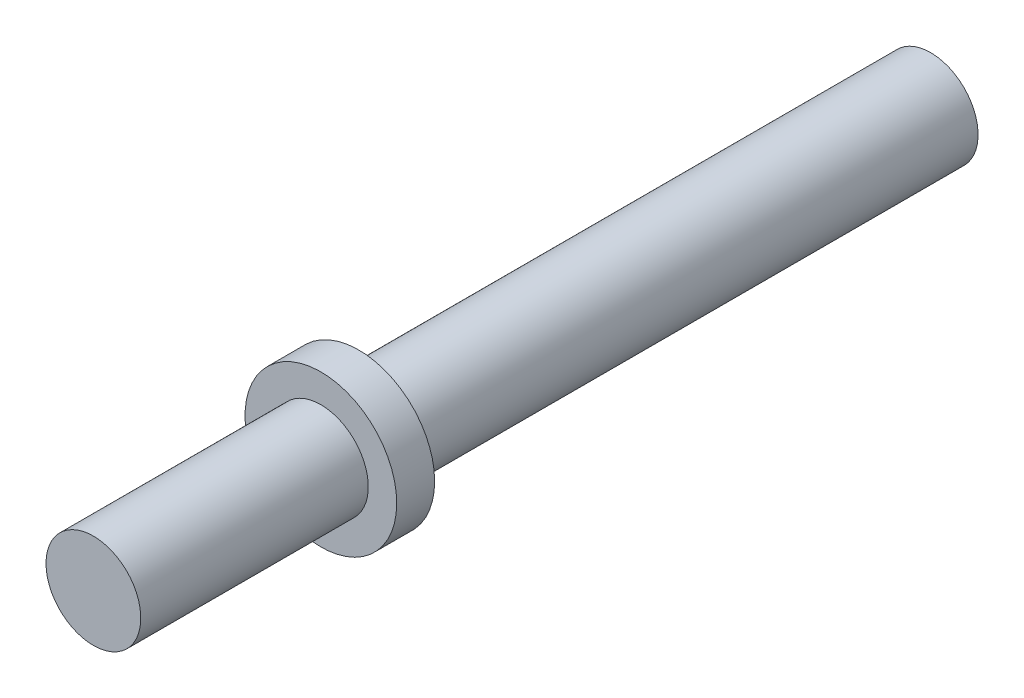
ISO-10303-21;
HEADER;
FILE_DESCRIPTION(('STEP AP214'),'2;1');
FILE_NAME('part.step','',(''),(''),'','','');
FILE_SCHEMA(('AUTOMOTIVE_DESIGN { 1 0 10303 214 1 1 1 1 }'));
ENDSEC;
DATA;
#1=APPLICATION_CONTEXT('core data for automotive mechanical design processes');
#2=APPLICATION_PROTOCOL_DEFINITION('international standard','automotive_design',2000,#1);
#3=PRODUCT_CONTEXT('',#1,'mechanical');
#4=PRODUCT('Part','Part','',(#3));
#5=PRODUCT_RELATED_PRODUCT_CATEGORY('part','',(#4));
#6=PRODUCT_DEFINITION_FORMATION('','',#4);
#7=PRODUCT_DEFINITION_CONTEXT('part definition',#1,'design');
#8=PRODUCT_DEFINITION('design','',#6,#7);
#9=PRODUCT_DEFINITION_SHAPE('','',#8);
#10=(LENGTH_UNIT() NAMED_UNIT(*) SI_UNIT(.MILLI.,.METRE.));
#11=(NAMED_UNIT(*) PLANE_ANGLE_UNIT() SI_UNIT($,.RADIAN.));
#12=(NAMED_UNIT(*) SI_UNIT($,.STERADIAN.) SOLID_ANGLE_UNIT());
#13=UNCERTAINTY_MEASURE_WITH_UNIT(LENGTH_MEASURE(1.E-05),#10,'distance_accuracy_value','');
#14=(GEOMETRIC_REPRESENTATION_CONTEXT(3) GLOBAL_UNCERTAINTY_ASSIGNED_CONTEXT((#13)) GLOBAL_UNIT_ASSIGNED_CONTEXT((#10,
#11,#12)) REPRESENTATION_CONTEXT('',''));
#15=CARTESIAN_POINT('',(0.,0.,0.));
#16=DIRECTION('',(0.,0.,1.));
#17=DIRECTION('',(1.,0.,0.));
#18=AXIS2_PLACEMENT_3D('',#15,#16,#17);
#19=CARTESIAN_POINT('',(-32.018684277368,-41.7454165571395,44.));
#20=DIRECTION('',(0.,0.,-1.));
#21=DIRECTION('',(-1.,0.,0.));
#22=AXIS2_PLACEMENT_3D('',#19,#20,#21);
#23=CYLINDRICAL_SURFACE('',#22,1.5);
#24=CARTESIAN_POINT('',(-32.018684277368,-41.7454165571395,36.8));
#25=DIRECTION('',(0.,0.,1.));
#26=DIRECTION('',(1.,0.,0.));
#27=AXIS2_PLACEMENT_3D('',#24,#25,#26);
#28=CIRCLE('',#27,1.5);
#29=CARTESIAN_POINT('',(-33.518684277368,-41.7454165571395,36.8));
#30=VERTEX_POINT('',#29);
#31=EDGE_CURVE('E44',#30,#30,#28,.T.);
#32=CARTESIAN_POINT('',(-32.018684277368,-41.7454165571395,44.));
#33=DIRECTION('',(0.,0.,1.));
#34=DIRECTION('',(1.,0.,0.));
#35=AXIS2_PLACEMENT_3D('',#32,#33,#34);
#36=CIRCLE('',#35,1.5);
#37=CARTESIAN_POINT('',(-33.518684277368,-41.7454165571395,44.));
#38=VERTEX_POINT('',#37);
#39=EDGE_CURVE('E48',#38,#38,#36,.T.);
#40=CARTESIAN_POINT('',(-33.518684277368,-41.7454165571395,36.8));
#41=CARTESIAN_POINT('',(-33.518684277368,-41.7454165571395,36.875));
#42=CARTESIAN_POINT('',(-33.518684277368,-41.7454165571395,36.95));
#43=CARTESIAN_POINT('',(-33.518684277368,-41.7454165571395,37.1));
#44=CARTESIAN_POINT('',(-33.518684277368,-41.7454165571395,37.175));
#45=CARTESIAN_POINT('',(-33.518684277368,-41.7454165571395,37.325));
#46=CARTESIAN_POINT('',(-33.518684277368,-41.7454165571395,37.4));
#47=CARTESIAN_POINT('',(-33.518684277368,-41.7454165571395,37.55));
#48=CARTESIAN_POINT('',(-33.518684277368,-41.7454165571395,37.625));
#49=CARTESIAN_POINT('',(-33.518684277368,-41.7454165571395,37.775));
#50=CARTESIAN_POINT('',(-33.518684277368,-41.7454165571395,37.85));
#51=CARTESIAN_POINT('',(-33.518684277368,-41.7454165571395,38.));
#52=CARTESIAN_POINT('',(-33.518684277368,-41.7454165571395,38.075));
#53=CARTESIAN_POINT('',(-33.518684277368,-41.7454165571395,38.225));
#54=CARTESIAN_POINT('',(-33.518684277368,-41.7454165571395,38.3));
#55=CARTESIAN_POINT('',(-33.518684277368,-41.7454165571395,38.45));
#56=CARTESIAN_POINT('',(-33.518684277368,-41.7454165571395,38.525));
#57=CARTESIAN_POINT('',(-33.518684277368,-41.7454165571395,38.675));
#58=CARTESIAN_POINT('',(-33.518684277368,-41.7454165571395,38.75));
#59=CARTESIAN_POINT('',(-33.518684277368,-41.7454165571395,38.9));
#60=CARTESIAN_POINT('',(-33.518684277368,-41.7454165571395,38.975));
#61=CARTESIAN_POINT('',(-33.518684277368,-41.7454165571395,39.125));
#62=CARTESIAN_POINT('',(-33.518684277368,-41.7454165571395,39.2));
#63=CARTESIAN_POINT('',(-33.518684277368,-41.7454165571395,39.35));
#64=CARTESIAN_POINT('',(-33.518684277368,-41.7454165571395,39.425));
#65=CARTESIAN_POINT('',(-33.518684277368,-41.7454165571395,39.575));
#66=CARTESIAN_POINT('',(-33.518684277368,-41.7454165571395,39.65));
#67=CARTESIAN_POINT('',(-33.518684277368,-41.7454165571395,39.8));
#68=CARTESIAN_POINT('',(-33.518684277368,-41.7454165571395,39.875));
#69=CARTESIAN_POINT('',(-33.518684277368,-41.7454165571395,40.025));
#70=CARTESIAN_POINT('',(-33.518684277368,-41.7454165571395,40.1));
#71=CARTESIAN_POINT('',(-33.518684277368,-41.7454165571395,40.25));
#72=CARTESIAN_POINT('',(-33.518684277368,-41.7454165571395,40.325));
#73=CARTESIAN_POINT('',(-33.518684277368,-41.7454165571395,40.475));
#74=CARTESIAN_POINT('',(-33.518684277368,-41.7454165571395,40.55));
#75=CARTESIAN_POINT('',(-33.518684277368,-41.7454165571395,40.7));
#76=CARTESIAN_POINT('',(-33.518684277368,-41.7454165571395,40.775));
#77=CARTESIAN_POINT('',(-33.518684277368,-41.7454165571395,40.925));
#78=CARTESIAN_POINT('',(-33.518684277368,-41.7454165571395,41.));
#79=CARTESIAN_POINT('',(-33.518684277368,-41.7454165571395,41.15));
#80=CARTESIAN_POINT('',(-33.518684277368,-41.7454165571395,41.225));
#81=CARTESIAN_POINT('',(-33.518684277368,-41.7454165571395,41.375));
#82=CARTESIAN_POINT('',(-33.518684277368,-41.7454165571395,41.45));
#83=CARTESIAN_POINT('',(-33.518684277368,-41.7454165571395,41.6));
#84=CARTESIAN_POINT('',(-33.518684277368,-41.7454165571395,41.675));
#85=CARTESIAN_POINT('',(-33.518684277368,-41.7454165571395,41.825));
#86=CARTESIAN_POINT('',(-33.518684277368,-41.7454165571395,41.9));
#87=CARTESIAN_POINT('',(-33.518684277368,-41.7454165571395,42.05));
#88=CARTESIAN_POINT('',(-33.518684277368,-41.7454165571395,42.125));
#89=CARTESIAN_POINT('',(-33.518684277368,-41.7454165571395,42.275));
#90=CARTESIAN_POINT('',(-33.518684277368,-41.7454165571395,42.35));
#91=CARTESIAN_POINT('',(-33.518684277368,-41.7454165571395,42.5));
#92=CARTESIAN_POINT('',(-33.518684277368,-41.7454165571395,42.575));
#93=CARTESIAN_POINT('',(-33.518684277368,-41.7454165571395,42.725));
#94=CARTESIAN_POINT('',(-33.518684277368,-41.7454165571395,42.8));
#95=CARTESIAN_POINT('',(-33.518684277368,-41.7454165571395,42.95));
#96=CARTESIAN_POINT('',(-33.518684277368,-41.7454165571395,43.025));
#97=CARTESIAN_POINT('',(-33.518684277368,-41.7454165571395,43.175));
#98=CARTESIAN_POINT('',(-33.518684277368,-41.7454165571395,43.25));
#99=CARTESIAN_POINT('',(-33.518684277368,-41.7454165571395,43.4));
#100=CARTESIAN_POINT('',(-33.518684277368,-41.7454165571395,43.475));
#101=CARTESIAN_POINT('',(-33.518684277368,-41.7454165571395,43.625));
#102=CARTESIAN_POINT('',(-33.518684277368,-41.7454165571395,43.7));
#103=CARTESIAN_POINT('',(-33.518684277368,-41.7454165571395,43.85));
#104=CARTESIAN_POINT('',(-33.518684277368,-41.7454165571395,43.925));
#105=CARTESIAN_POINT('',(-33.518684277368,-41.7454165571395,44.));
#106=B_SPLINE_CURVE_WITH_KNOTS('',3,(#40,#41,#42,#43,#44,#45,#46,#47,#48,#49,#50,#51,#52,#53,
#54,#55,#56,#57,#58,#59,#60,#61,#62,#63,#64,#65,#66,#67,#68,#69,#70,#71,#72,#73,#74,#75,#76,#77,
#78,#79,#80,#81,#82,#83,#84,#85,#86,#87,#88,#89,#90,#91,#92,#93,#94,#95,#96,#97,#98,#99,#100,
#101,#102,#103,#104,#105),.UNSPECIFIED.,.F.,.F.,(4,2,2,2,2,2,2,2,2,2,2,2,2,2,2,2,2,2,2,2,2,2,2,
2,2,2,2,2,2,2,2,2,4),(0.,0.225000000000003,0.449999999999999,0.675000000000002,
0.900000000000005,1.125,1.35,1.575,1.8,2.02500000000001,2.25,2.475,2.7,2.925,3.15,3.375,3.6,
3.825,4.05000000000001,4.275,4.5,4.725,4.95,5.175,5.4,5.62500000000001,5.85,6.075,6.3,6.525,
6.75,6.975,7.2),.UNSPECIFIED.);
#107=EDGE_CURVE('BSEAM41',#30,#38,#106,.T.);
#108=ORIENTED_EDGE('',*,*,#31,.T.);
#109=ORIENTED_EDGE('',*,*,#39,.F.);
#110=ORIENTED_EDGE('',*,*,#107,.T.);
#111=ORIENTED_EDGE('',*,*,#107,.F.);
#112=EDGE_LOOP('',(#108,#110,#109,#111));
#113=FACE_BOUND('',#112,.T.);
#114=ADVANCED_FACE('F41',(#113),#23,.T.);
#115=CARTESIAN_POINT('',(-32.018684277368,-41.7454165571395,44.));
#116=DIRECTION('',(0.,0.,1.));
#117=DIRECTION('',(1.,0.,0.));
#118=AXIS2_PLACEMENT_3D('',#115,#116,#117);
#119=PLANE('',#118);
#120=ORIENTED_EDGE('',*,*,#39,.T.);
#121=EDGE_LOOP('',(#120));
#122=FACE_BOUND('',#121,.T.);
#123=ADVANCED_FACE('F80',(#122),#119,.T.);
#124=CARTESIAN_POINT('',(-32.018684277368,-41.7454165571395,36.8));
#125=DIRECTION('',(0.,0.,-1.));
#126=DIRECTION('',(-1.,0.,0.));
#127=AXIS2_PLACEMENT_3D('',#124,#125,#126);
#128=CYLINDRICAL_SURFACE('',#127,2.4);
#129=CARTESIAN_POINT('',(-32.018684277368,-41.7454165571395,36.8));
#130=DIRECTION('',(0.,0.,1.));
#131=DIRECTION('',(1.,0.,0.));
#132=AXIS2_PLACEMENT_3D('',#129,#130,#131);
#133=CIRCLE('',#132,2.4);
#134=CARTESIAN_POINT('',(-29.618684277368,-41.7454165571395,36.8));
#135=VERTEX_POINT('',#134);
#136=EDGE_CURVE('E60',#135,#135,#133,.T.);
#137=ORIENTED_EDGE('',*,*,#136,.F.);
#138=EDGE_LOOP('',(#137));
#139=FACE_BOUND('',#138,.T.);
#140=CARTESIAN_POINT('',(-32.018684277368,-41.7454165571395,35.6));
#141=DIRECTION('',(0.,0.,1.));
#142=DIRECTION('',(1.,0.,0.));
#143=AXIS2_PLACEMENT_3D('',#140,#141,#142);
#144=CIRCLE('',#143,2.4);
#145=CARTESIAN_POINT('',(-29.618684277368,-41.7454165571395,35.6));
#146=VERTEX_POINT('',#145);
#147=EDGE_CURVE('E57',#146,#146,#144,.T.);
#148=ORIENTED_EDGE('',*,*,#147,.T.);
#149=EDGE_LOOP('',(#148));
#150=FACE_BOUND('',#149,.T.);
#151=ADVANCED_FACE('F72',(#139,#150),#128,.T.);
#152=CARTESIAN_POINT('',(-32.018684277368,-41.7454165571395,36.8));
#153=DIRECTION('',(0.,0.,1.));
#154=DIRECTION('',(1.,0.,0.));
#155=AXIS2_PLACEMENT_3D('',#152,#153,#154);
#156=PLANE('',#155);
#157=ORIENTED_EDGE('',*,*,#31,.F.);
#158=EDGE_LOOP('',(#157));
#159=FACE_BOUND('',#158,.T.);
#160=ORIENTED_EDGE('',*,*,#136,.T.);
#161=EDGE_LOOP('',(#160));
#162=FACE_BOUND('',#161,.T.);
#163=ADVANCED_FACE('F69',(#159,#162),#156,.T.);
#164=CARTESIAN_POINT('',(-32.018684277368,-41.7454165571395,35.6));
#165=DIRECTION('',(0.,0.,1.));
#166=DIRECTION('',(1.,0.,0.));
#167=AXIS2_PLACEMENT_3D('',#164,#165,#166);
#168=PLANE('',#167);
#169=CARTESIAN_POINT('',(-32.018684277368,-41.7454165571395,35.6));
#170=DIRECTION('',(0.,0.,1.));
#171=DIRECTION('',(1.,0.,0.));
#172=AXIS2_PLACEMENT_3D('',#169,#170,#171);
#173=CIRCLE('',#172,1.5);
#174=CARTESIAN_POINT('',(-33.518684277368,-41.7454165571395,35.6));
#175=VERTEX_POINT('',#174);
#176=EDGE_CURVE('E10',#175,#175,#173,.T.);
#177=ORIENTED_EDGE('',*,*,#176,.T.);
#178=EDGE_LOOP('',(#177));
#179=FACE_BOUND('',#178,.T.);
#180=ORIENTED_EDGE('',*,*,#147,.F.);
#181=EDGE_LOOP('',(#180));
#182=FACE_BOUND('',#181,.T.);
#183=ADVANCED_FACE('F71',(#179,#182),#168,.F.);
#184=CARTESIAN_POINT('',(-32.018684277368,-41.7454165571395,17.500063));
#185=DIRECTION('',(0.,0.,1.));
#186=DIRECTION('',(1.,0.,0.));
#187=AXIS2_PLACEMENT_3D('',#184,#185,#186);
#188=PLANE('',#187);
#189=CARTESIAN_POINT('',(-32.018684277368,-41.7454165571395,17.500063));
#190=DIRECTION('',(0.,0.,1.));
#191=DIRECTION('',(1.,0.,0.));
#192=AXIS2_PLACEMENT_3D('',#189,#190,#191);
#193=CIRCLE('',#192,1.5);
#194=CARTESIAN_POINT('',(-33.518684277368,-41.7454165571395,17.500063));
#195=VERTEX_POINT('',#194);
#196=EDGE_CURVE('E52',#195,#195,#193,.T.);
#197=ORIENTED_EDGE('',*,*,#196,.F.);
#198=EDGE_LOOP('',(#197));
#199=FACE_BOUND('',#198,.T.);
#200=ADVANCED_FACE('F78',(#199),#188,.F.);
#201=CARTESIAN_POINT('',(-33.518684277368,-41.7454165571395,17.500063));
#202=CARTESIAN_POINT('',(-33.518684277368,-41.7454165571395,17.6886040104167));
#203=CARTESIAN_POINT('',(-33.518684277368,-41.7454165571395,17.8771450208333));
#204=CARTESIAN_POINT('',(-33.518684277368,-41.7454165571395,18.2542270416667));
#205=CARTESIAN_POINT('',(-33.518684277368,-41.7454165571395,18.4427680520833));
#206=CARTESIAN_POINT('',(-33.518684277368,-41.7454165571395,18.8198500729167));
#207=CARTESIAN_POINT('',(-33.518684277368,-41.7454165571395,19.0083910833333));
#208=CARTESIAN_POINT('',(-33.518684277368,-41.7454165571395,19.3854731041667));
#209=CARTESIAN_POINT('',(-33.518684277368,-41.7454165571395,19.5740141145833));
#210=CARTESIAN_POINT('',(-33.518684277368,-41.7454165571395,19.9510961354167));
#211=CARTESIAN_POINT('',(-33.518684277368,-41.7454165571395,20.1396371458333));
#212=CARTESIAN_POINT('',(-33.518684277368,-41.7454165571395,20.5167191666667));
#213=CARTESIAN_POINT('',(-33.518684277368,-41.7454165571395,20.7052601770833));
#214=CARTESIAN_POINT('',(-33.518684277368,-41.7454165571395,21.0823421979167));
#215=CARTESIAN_POINT('',(-33.518684277368,-41.7454165571395,21.2708832083333));
#216=CARTESIAN_POINT('',(-33.518684277368,-41.7454165571395,21.6479652291667));
#217=CARTESIAN_POINT('',(-33.518684277368,-41.7454165571395,21.8365062395833));
#218=CARTESIAN_POINT('',(-33.518684277368,-41.7454165571395,22.2135882604167));
#219=CARTESIAN_POINT('',(-33.518684277368,-41.7454165571395,22.4021292708333));
#220=CARTESIAN_POINT('',(-33.518684277368,-41.7454165571395,22.7792112916667));
#221=CARTESIAN_POINT('',(-33.518684277368,-41.7454165571395,22.9677523020833));
#222=CARTESIAN_POINT('',(-33.518684277368,-41.7454165571395,23.3448343229167));
#223=CARTESIAN_POINT('',(-33.518684277368,-41.7454165571395,23.5333753333333));
#224=CARTESIAN_POINT('',(-33.518684277368,-41.7454165571395,23.9104573541667));
#225=CARTESIAN_POINT('',(-33.518684277368,-41.7454165571395,24.0989983645833));
#226=CARTESIAN_POINT('',(-33.518684277368,-41.7454165571395,24.4760803854167));
#227=CARTESIAN_POINT('',(-33.518684277368,-41.7454165571395,24.6646213958333));
#228=CARTESIAN_POINT('',(-33.518684277368,-41.7454165571395,25.0417034166667));
#229=CARTESIAN_POINT('',(-33.518684277368,-41.7454165571395,25.2302444270833));
#230=CARTESIAN_POINT('',(-33.518684277368,-41.7454165571395,25.6073264479167));
#231=CARTESIAN_POINT('',(-33.518684277368,-41.7454165571395,25.7958674583333));
#232=CARTESIAN_POINT('',(-33.518684277368,-41.7454165571395,26.1729494791667));
#233=CARTESIAN_POINT('',(-33.518684277368,-41.7454165571395,26.3614904895833));
#234=CARTESIAN_POINT('',(-33.518684277368,-41.7454165571395,26.7385725104167));
#235=CARTESIAN_POINT('',(-33.518684277368,-41.7454165571395,26.9271135208333));
#236=CARTESIAN_POINT('',(-33.518684277368,-41.7454165571395,27.3041955416667));
#237=CARTESIAN_POINT('',(-33.518684277368,-41.7454165571395,27.4927365520833));
#238=CARTESIAN_POINT('',(-33.518684277368,-41.7454165571395,27.8698185729167));
#239=CARTESIAN_POINT('',(-33.518684277368,-41.7454165571395,28.0583595833333));
#240=CARTESIAN_POINT('',(-33.518684277368,-41.7454165571395,28.4354416041667));
#241=CARTESIAN_POINT('',(-33.518684277368,-41.7454165571395,28.6239826145833));
#242=CARTESIAN_POINT('',(-33.518684277368,-41.7454165571395,29.0010646354167));
#243=CARTESIAN_POINT('',(-33.518684277368,-41.7454165571395,29.1896056458333));
#244=CARTESIAN_POINT('',(-33.518684277368,-41.7454165571395,29.5666876666667));
#245=CARTESIAN_POINT('',(-33.518684277368,-41.7454165571395,29.7552286770833));
#246=CARTESIAN_POINT('',(-33.518684277368,-41.7454165571395,30.1323106979167));
#247=CARTESIAN_POINT('',(-33.518684277368,-41.7454165571395,30.3208517083333));
#248=CARTESIAN_POINT('',(-33.518684277368,-41.7454165571395,30.6979337291667));
#249=CARTESIAN_POINT('',(-33.518684277368,-41.7454165571395,30.8864747395833));
#250=CARTESIAN_POINT('',(-33.518684277368,-41.7454165571395,31.2635567604167));
#251=CARTESIAN_POINT('',(-33.518684277368,-41.7454165571395,31.4520977708333));
#252=CARTESIAN_POINT('',(-33.518684277368,-41.7454165571395,31.8291797916667));
#253=CARTESIAN_POINT('',(-33.518684277368,-41.7454165571395,32.0177208020833));
#254=CARTESIAN_POINT('',(-33.518684277368,-41.7454165571395,32.3948028229167));
#255=CARTESIAN_POINT('',(-33.518684277368,-41.7454165571395,32.5833438333333));
#256=CARTESIAN_POINT('',(-33.518684277368,-41.7454165571395,32.9604258541667));
#257=CARTESIAN_POINT('',(-33.518684277368,-41.7454165571395,33.1489668645833));
#258=CARTESIAN_POINT('',(-33.518684277368,-41.7454165571395,33.5260488854167));
#259=CARTESIAN_POINT('',(-33.518684277368,-41.7454165571395,33.7145898958333));
#260=CARTESIAN_POINT('',(-33.518684277368,-41.7454165571395,34.0916719166667));
#261=CARTESIAN_POINT('',(-33.518684277368,-41.7454165571395,34.2802129270833));
#262=CARTESIAN_POINT('',(-33.518684277368,-41.7454165571395,34.6572949479167));
#263=CARTESIAN_POINT('',(-33.518684277368,-41.7454165571395,34.8458359583333));
#264=CARTESIAN_POINT('',(-33.518684277368,-41.7454165571395,35.2229179791667));
#265=CARTESIAN_POINT('',(-33.518684277368,-41.7454165571395,35.4114589895833));
#266=CARTESIAN_POINT('',(-33.518684277368,-41.7454165571395,35.6));
#267=B_SPLINE_CURVE_WITH_KNOTS('',3,(#201,#202,#203,#204,#205,#206,#207,#208,#209,#210,#211,
#212,#213,#214,#215,#216,#217,#218,#219,#220,#221,#222,#223,#224,#225,#226,#227,#228,#229,#230,
#231,#232,#233,#234,#235,#236,#237,#238,#239,#240,#241,#242,#243,#244,#245,#246,#247,#248,#249,
#250,#251,#252,#253,#254,#255,#256,#257,#258,#259,#260,#261,#262,#263,#264,#265,#266),
.UNSPECIFIED.,.F.,.F.,(4,2,2,2,2,2,2,2,2,2,2,2,2,2,2,2,2,2,2,2,2,2,2,2,2,2,2,2,2,2,2,2,4),(0.,
0.56562303125,1.1312460625,1.69686909375,2.262492125,2.82811515625,3.3937381875,3.95936121875,
4.52498425,5.09060728125,5.6562303125,6.22185334375,6.787476375,7.35309940625,7.9187224375,
8.48434546875,9.0499685,9.61559153125,10.1812145625,10.74683759375,11.312460625,11.87808365625,
12.4437066875,13.00932971875,13.57495275,14.14057578125,14.7061988125,15.27182184375,
15.837444875,16.40306790625,16.9686909375,17.53431396875,18.099937),.UNSPECIFIED.);
#268=EDGE_CURVE('BSEAM84',#195,#175,#267,.T.);
#269=ORIENTED_EDGE('',*,*,#196,.T.);
#270=ORIENTED_EDGE('',*,*,#176,.F.);
#271=ORIENTED_EDGE('',*,*,#268,.T.);
#272=ORIENTED_EDGE('',*,*,#268,.F.);
#273=EDGE_LOOP('',(#269,#271,#270,#272));
#274=FACE_BOUND('',#273,.T.);
#275=ADVANCED_FACE('F84',(#274),#23,.T.);
#276=CLOSED_SHELL('',(#114,#123,#151,#163,#183,#200,#275));
#277=MANIFOLD_SOLID_BREP('B2',#276);
#278=ADVANCED_BREP_SHAPE_REPRESENTATION('',(#18,#277),#14);
#279=SHAPE_DEFINITION_REPRESENTATION(#9,#278);
ENDSEC;
END-ISO-10303-21;
